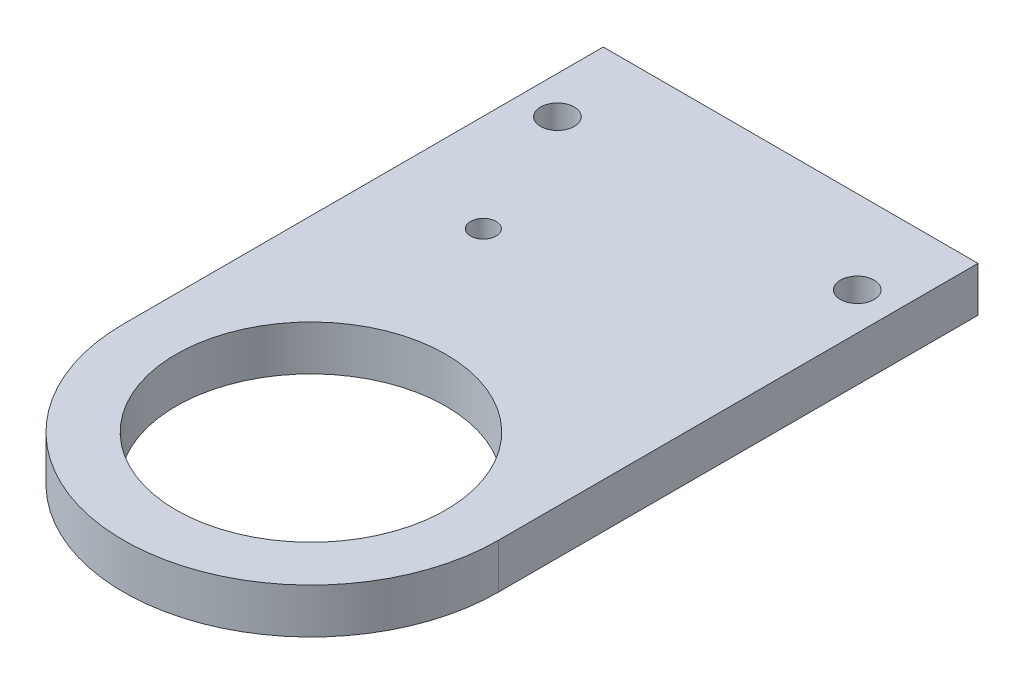
ISO-10303-21;
HEADER;
FILE_DESCRIPTION(('STEP AP214'),'2;1');
FILE_NAME('part.step','',(''),(''),'','','');
FILE_SCHEMA(('AUTOMOTIVE_DESIGN { 1 0 10303 214 1 1 1 1 }'));
ENDSEC;
DATA;
#1=APPLICATION_CONTEXT('core data for automotive mechanical design processes');
#2=APPLICATION_PROTOCOL_DEFINITION('international standard','automotive_design',2000,#1);
#3=PRODUCT_CONTEXT('',#1,'mechanical');
#4=PRODUCT('Part','Part','',(#3));
#5=PRODUCT_RELATED_PRODUCT_CATEGORY('part','',(#4));
#6=PRODUCT_DEFINITION_FORMATION('','',#4);
#7=PRODUCT_DEFINITION_CONTEXT('part definition',#1,'design');
#8=PRODUCT_DEFINITION('design','',#6,#7);
#9=PRODUCT_DEFINITION_SHAPE('','',#8);
#10=(LENGTH_UNIT() NAMED_UNIT(*) SI_UNIT(.MILLI.,.METRE.));
#11=(NAMED_UNIT(*) PLANE_ANGLE_UNIT() SI_UNIT($,.RADIAN.));
#12=(NAMED_UNIT(*) SI_UNIT($,.STERADIAN.) SOLID_ANGLE_UNIT());
#13=UNCERTAINTY_MEASURE_WITH_UNIT(LENGTH_MEASURE(1.E-05),#10,'distance_accuracy_value','');
#14=(GEOMETRIC_REPRESENTATION_CONTEXT(3) GLOBAL_UNCERTAINTY_ASSIGNED_CONTEXT((#13)) GLOBAL_UNIT_ASSIGNED_CONTEXT((#10,
#11,#12)) REPRESENTATION_CONTEXT('',''));
#15=CARTESIAN_POINT('',(0.,0.,0.));
#16=DIRECTION('',(0.,0.,1.));
#17=DIRECTION('',(1.,0.,0.));
#18=AXIS2_PLACEMENT_3D('',#15,#16,#17);
#19=CARTESIAN_POINT('',(25.,27.5,490.));
#20=DIRECTION('',(-1.,0.,0.));
#21=DIRECTION('',(0.,0.,1.));
#22=AXIS2_PLACEMENT_3D('',#19,#20,#21);
#23=PLANE('',#22);
#24=DIRECTION('',(0.,0.,-1.));
#25=VECTOR('',#24,1.);
#26=CARTESIAN_POINT('',(25.,21.5,490.));
#27=LINE('',#26,#25);
#28=CARTESIAN_POINT('',(25.,21.5,490.));
#29=VERTEX_POINT('',#28);
#30=CARTESIAN_POINT('',(25.,21.5,426.));
#31=VERTEX_POINT('',#30);
#32=EDGE_CURVE('E107',#29,#31,#27,.T.);
#33=ORIENTED_EDGE('',*,*,#32,.T.);
#34=DIRECTION('',(0.,-1.,0.));
#35=VECTOR('',#34,1.);
#36=CARTESIAN_POINT('',(25.,27.5,426.));
#37=LINE('',#36,#35);
#38=CARTESIAN_POINT('',(25.,27.5,426.));
#39=VERTEX_POINT('',#38);
#40=EDGE_CURVE('E11',#39,#31,#37,.T.);
#41=ORIENTED_EDGE('',*,*,#40,.F.);
#42=DIRECTION('',(0.,0.,-1.));
#43=VECTOR('',#42,1.);
#44=CARTESIAN_POINT('',(25.,27.5,490.));
#45=LINE('',#44,#43);
#46=CARTESIAN_POINT('',(25.,27.5,490.));
#47=VERTEX_POINT('',#46);
#48=EDGE_CURVE('E58',#47,#39,#45,.T.);
#49=ORIENTED_EDGE('',*,*,#48,.F.);
#50=DIRECTION('',(0.,-1.,0.));
#51=VECTOR('',#50,1.);
#52=CARTESIAN_POINT('',(25.,27.5,490.));
#53=LINE('',#52,#51);
#54=EDGE_CURVE('E76',#47,#29,#53,.T.);
#55=ORIENTED_EDGE('',*,*,#54,.T.);
#56=EDGE_LOOP('',(#33,#41,#49,#55));
#57=FACE_BOUND('',#56,.T.);
#58=ADVANCED_FACE('F43',(#57),#23,.F.);
#59=CARTESIAN_POINT('',(-25.,27.5,426.));
#60=DIRECTION('',(0.,0.,1.));
#61=DIRECTION('',(1.,0.,0.));
#62=AXIS2_PLACEMENT_3D('',#59,#60,#61);
#63=PLANE('',#62);
#64=DIRECTION('',(-1.,0.,0.));
#65=VECTOR('',#64,1.);
#66=CARTESIAN_POINT('',(-25.,21.5,426.));
#67=LINE('',#66,#65);
#68=CARTESIAN_POINT('',(-25.,21.5,426.));
#69=VERTEX_POINT('',#68);
#70=EDGE_CURVE('E74',#31,#69,#67,.T.);
#71=ORIENTED_EDGE('',*,*,#70,.T.);
#72=DIRECTION('',(0.,-1.,0.));
#73=VECTOR('',#72,1.);
#74=CARTESIAN_POINT('',(-25.,27.5,426.));
#75=LINE('',#74,#73);
#76=CARTESIAN_POINT('',(-25.,27.5,426.));
#77=VERTEX_POINT('',#76);
#78=EDGE_CURVE('E55',#77,#69,#75,.T.);
#79=ORIENTED_EDGE('',*,*,#78,.F.);
#80=DIRECTION('',(-1.,0.,0.));
#81=VECTOR('',#80,1.);
#82=CARTESIAN_POINT('',(-25.,27.5,426.));
#83=LINE('',#82,#81);
#84=EDGE_CURVE('E81',#39,#77,#83,.T.);
#85=ORIENTED_EDGE('',*,*,#84,.F.);
#86=ORIENTED_EDGE('',*,*,#40,.T.);
#87=EDGE_LOOP('',(#71,#79,#85,#86));
#88=FACE_BOUND('',#87,.T.);
#89=ADVANCED_FACE('F174',(#88),#63,.F.);
#90=CARTESIAN_POINT('',(-25.,27.5,490.));
#91=DIRECTION('',(1.,0.,0.));
#92=DIRECTION('',(0.,0.,-1.));
#93=AXIS2_PLACEMENT_3D('',#90,#91,#92);
#94=PLANE('',#93);
#95=DIRECTION('',(0.,0.,1.));
#96=VECTOR('',#95,1.);
#97=CARTESIAN_POINT('',(-25.,21.5,490.));
#98=LINE('',#97,#96);
#99=CARTESIAN_POINT('',(-25.,21.5,490.));
#100=VERTEX_POINT('',#99);
#101=EDGE_CURVE('E90',#69,#100,#98,.T.);
#102=ORIENTED_EDGE('',*,*,#101,.T.);
#103=DIRECTION('',(0.,-1.,0.));
#104=VECTOR('',#103,1.);
#105=CARTESIAN_POINT('',(-25.,27.5,490.));
#106=LINE('',#105,#104);
#107=CARTESIAN_POINT('',(-25.,27.5,490.));
#108=VERTEX_POINT('',#107);
#109=EDGE_CURVE('E91',#108,#100,#106,.T.);
#110=ORIENTED_EDGE('',*,*,#109,.F.);
#111=DIRECTION('',(0.,0.,1.));
#112=VECTOR('',#111,1.);
#113=CARTESIAN_POINT('',(-25.,27.5,490.));
#114=LINE('',#113,#112);
#115=EDGE_CURVE('E127',#77,#108,#114,.T.);
#116=ORIENTED_EDGE('',*,*,#115,.F.);
#117=ORIENTED_EDGE('',*,*,#78,.T.);
#118=EDGE_LOOP('',(#102,#110,#116,#117));
#119=FACE_BOUND('',#118,.T.);
#120=ADVANCED_FACE('F93',(#119),#94,.F.);
#121=CARTESIAN_POINT('',(0.,27.5,0.));
#122=DIRECTION('',(0.,-1.,0.));
#123=DIRECTION('',(0.,0.,-1.));
#124=AXIS2_PLACEMENT_3D('',#121,#122,#123);
#125=PLANE('',#124);
#126=CARTESIAN_POINT('',(-12.,27.5,455.));
#127=DIRECTION('',(0.,1.,0.));
#128=DIRECTION('',(0.,0.,1.));
#129=AXIS2_PLACEMENT_3D('',#126,#127,#128);
#130=CIRCLE('',#129,1.7);
#131=CARTESIAN_POINT('',(-12.,27.5,456.7));
#132=VERTEX_POINT('',#131);
#133=EDGE_CURVE('E146',#132,#132,#130,.T.);
#134=ORIENTED_EDGE('',*,*,#133,.F.);
#135=EDGE_LOOP('',(#134));
#136=FACE_BOUND('',#135,.T.);
#137=CARTESIAN_POINT('',(-20.,27.5,437.11));
#138=DIRECTION('',(0.,1.,0.));
#139=DIRECTION('',(0.,0.,1.));
#140=AXIS2_PLACEMENT_3D('',#137,#138,#139);
#141=CIRCLE('',#140,2.25);
#142=CARTESIAN_POINT('',(-20.,27.5,439.36));
#143=VERTEX_POINT('',#142);
#144=EDGE_CURVE('E134',#143,#143,#141,.T.);
#145=ORIENTED_EDGE('',*,*,#144,.F.);
#146=EDGE_LOOP('',(#145));
#147=FACE_BOUND('',#146,.T.);
#148=CARTESIAN_POINT('',(20.,27.5,437.11));
#149=DIRECTION('',(0.,1.,0.));
#150=DIRECTION('',(0.,0.,1.));
#151=AXIS2_PLACEMENT_3D('',#148,#149,#150);
#152=CIRCLE('',#151,2.25);
#153=CARTESIAN_POINT('',(20.,27.5,439.36));
#154=VERTEX_POINT('',#153);
#155=EDGE_CURVE('E142',#154,#154,#152,.T.);
#156=ORIENTED_EDGE('',*,*,#155,.F.);
#157=EDGE_LOOP('',(#156));
#158=FACE_BOUND('',#157,.T.);
#159=CARTESIAN_POINT('',(0.,27.5,490.));
#160=DIRECTION('',(0.,1.,0.));
#161=DIRECTION('',(0.,0.,1.));
#162=AXIS2_PLACEMENT_3D('',#159,#160,#161);
#163=CIRCLE('',#162,18.);
#164=CARTESIAN_POINT('',(0.,27.5,508.));
#165=VERTEX_POINT('',#164);
#166=EDGE_CURVE('E109',#165,#165,#163,.T.);
#167=ORIENTED_EDGE('',*,*,#166,.F.);
#168=EDGE_LOOP('',(#167));
#169=FACE_BOUND('',#168,.T.);
#170=ORIENTED_EDGE('',*,*,#115,.T.);
#171=CARTESIAN_POINT('',(0.,27.5,490.));
#172=DIRECTION('',(0.,1.,0.));
#173=DIRECTION('',(0.,0.,1.));
#174=AXIS2_PLACEMENT_3D('',#171,#172,#173);
#175=CIRCLE('',#174,25.);
#176=EDGE_CURVE('E102',#108,#47,#175,.T.);
#177=ORIENTED_EDGE('',*,*,#176,.T.);
#178=ORIENTED_EDGE('',*,*,#48,.T.);
#179=ORIENTED_EDGE('',*,*,#84,.T.);
#180=EDGE_LOOP('',(#170,#177,#178,#179));
#181=FACE_BOUND('',#180,.T.);
#182=ADVANCED_FACE('F163',(#136,#147,#158,#169,#181),#125,.F.);
#183=CARTESIAN_POINT('',(0.,21.5,0.));
#184=DIRECTION('',(0.,-1.,0.));
#185=DIRECTION('',(0.,0.,-1.));
#186=AXIS2_PLACEMENT_3D('',#183,#184,#185);
#187=PLANE('',#186);
#188=CARTESIAN_POINT('',(-12.,21.5,455.));
#189=DIRECTION('',(0.,1.,0.));
#190=DIRECTION('',(0.,0.,1.));
#191=AXIS2_PLACEMENT_3D('',#188,#189,#190);
#192=CIRCLE('',#191,1.7);
#193=CARTESIAN_POINT('',(-12.,21.5,456.7));
#194=VERTEX_POINT('',#193);
#195=EDGE_CURVE('E148',#194,#194,#192,.T.);
#196=ORIENTED_EDGE('',*,*,#195,.T.);
#197=EDGE_LOOP('',(#196));
#198=FACE_BOUND('',#197,.T.);
#199=CARTESIAN_POINT('',(-20.,21.5,437.11));
#200=DIRECTION('',(0.,1.,0.));
#201=DIRECTION('',(0.,0.,1.));
#202=AXIS2_PLACEMENT_3D('',#199,#200,#201);
#203=CIRCLE('',#202,2.25);
#204=CARTESIAN_POINT('',(-20.,21.5,439.36));
#205=VERTEX_POINT('',#204);
#206=EDGE_CURVE('E138',#205,#205,#203,.T.);
#207=ORIENTED_EDGE('',*,*,#206,.T.);
#208=EDGE_LOOP('',(#207));
#209=FACE_BOUND('',#208,.T.);
#210=CARTESIAN_POINT('',(20.,21.5,437.11));
#211=DIRECTION('',(0.,1.,0.));
#212=DIRECTION('',(0.,0.,1.));
#213=AXIS2_PLACEMENT_3D('',#210,#211,#212);
#214=CIRCLE('',#213,2.25);
#215=CARTESIAN_POINT('',(20.,21.5,439.36));
#216=VERTEX_POINT('',#215);
#217=EDGE_CURVE('E137',#216,#216,#214,.T.);
#218=ORIENTED_EDGE('',*,*,#217,.T.);
#219=EDGE_LOOP('',(#218));
#220=FACE_BOUND('',#219,.T.);
#221=CARTESIAN_POINT('',(0.,21.5,490.));
#222=DIRECTION('',(0.,1.,0.));
#223=DIRECTION('',(0.,0.,1.));
#224=AXIS2_PLACEMENT_3D('',#221,#222,#223);
#225=CIRCLE('',#224,18.);
#226=CARTESIAN_POINT('',(0.,21.5,508.));
#227=VERTEX_POINT('',#226);
#228=EDGE_CURVE('E116',#227,#227,#225,.T.);
#229=ORIENTED_EDGE('',*,*,#228,.T.);
#230=EDGE_LOOP('',(#229));
#231=FACE_BOUND('',#230,.T.);
#232=ORIENTED_EDGE('',*,*,#32,.F.);
#233=CARTESIAN_POINT('',(0.,21.5,490.));
#234=DIRECTION('',(0.,1.,0.));
#235=DIRECTION('',(0.,0.,1.));
#236=AXIS2_PLACEMENT_3D('',#233,#234,#235);
#237=CIRCLE('',#236,25.);
#238=EDGE_CURVE('E105',#100,#29,#237,.T.);
#239=ORIENTED_EDGE('',*,*,#238,.F.);
#240=ORIENTED_EDGE('',*,*,#101,.F.);
#241=ORIENTED_EDGE('',*,*,#70,.F.);
#242=EDGE_LOOP('',(#232,#239,#240,#241));
#243=FACE_BOUND('',#242,.T.);
#244=ADVANCED_FACE('F110',(#198,#209,#220,#231,#243),#187,.T.);
#245=CARTESIAN_POINT('',(0.,27.5,490.));
#246=DIRECTION('',(0.,-1.,0.));
#247=DIRECTION('',(0.,0.,-1.));
#248=AXIS2_PLACEMENT_3D('',#245,#246,#247);
#249=CYLINDRICAL_SURFACE('',#248,25.);
#250=ORIENTED_EDGE('',*,*,#238,.T.);
#251=ORIENTED_EDGE('',*,*,#54,.F.);
#252=ORIENTED_EDGE('',*,*,#176,.F.);
#253=ORIENTED_EDGE('',*,*,#109,.T.);
#254=EDGE_LOOP('',(#250,#251,#252,#253));
#255=FACE_BOUND('',#254,.T.);
#256=ADVANCED_FACE('F101',(#255),#249,.T.);
#257=CARTESIAN_POINT('',(0.,27.5,490.));
#258=DIRECTION('',(0.,-1.,0.));
#259=DIRECTION('',(0.,0.,-1.));
#260=AXIS2_PLACEMENT_3D('',#257,#258,#259);
#261=CYLINDRICAL_SURFACE('',#260,18.);
#262=ORIENTED_EDGE('',*,*,#166,.T.);
#263=EDGE_LOOP('',(#262));
#264=FACE_BOUND('',#263,.T.);
#265=ORIENTED_EDGE('',*,*,#228,.F.);
#266=EDGE_LOOP('',(#265));
#267=FACE_BOUND('',#266,.T.);
#268=ADVANCED_FACE('F188',(#264,#267),#261,.F.);
#269=CARTESIAN_POINT('',(20.,27.5,437.11));
#270=DIRECTION('',(0.,-1.,0.));
#271=DIRECTION('',(0.,0.,-1.));
#272=AXIS2_PLACEMENT_3D('',#269,#270,#271);
#273=CYLINDRICAL_SURFACE('',#272,2.25);
#274=ORIENTED_EDGE('',*,*,#155,.T.);
#275=EDGE_LOOP('',(#274));
#276=FACE_BOUND('',#275,.T.);
#277=ORIENTED_EDGE('',*,*,#217,.F.);
#278=EDGE_LOOP('',(#277));
#279=FACE_BOUND('',#278,.T.);
#280=ADVANCED_FACE('F189',(#276,#279),#273,.F.);
#281=CARTESIAN_POINT('',(-20.,27.5,437.11));
#282=DIRECTION('',(0.,-1.,0.));
#283=DIRECTION('',(0.,0.,-1.));
#284=AXIS2_PLACEMENT_3D('',#281,#282,#283);
#285=CYLINDRICAL_SURFACE('',#284,2.25);
#286=ORIENTED_EDGE('',*,*,#144,.T.);
#287=EDGE_LOOP('',(#286));
#288=FACE_BOUND('',#287,.T.);
#289=ORIENTED_EDGE('',*,*,#206,.F.);
#290=EDGE_LOOP('',(#289));
#291=FACE_BOUND('',#290,.T.);
#292=ADVANCED_FACE('F191',(#288,#291),#285,.F.);
#293=CARTESIAN_POINT('',(-12.,27.5,455.));
#294=DIRECTION('',(0.,-1.,0.));
#295=DIRECTION('',(0.,0.,-1.));
#296=AXIS2_PLACEMENT_3D('',#293,#294,#295);
#297=CYLINDRICAL_SURFACE('',#296,1.7);
#298=ORIENTED_EDGE('',*,*,#133,.T.);
#299=EDGE_LOOP('',(#298));
#300=FACE_BOUND('',#299,.T.);
#301=ORIENTED_EDGE('',*,*,#195,.F.);
#302=EDGE_LOOP('',(#301));
#303=FACE_BOUND('',#302,.T.);
#304=ADVANCED_FACE('F161',(#300,#303),#297,.F.);
#305=CLOSED_SHELL('',(#58,#89,#120,#182,#244,#256,#268,#280,#292,#304));
#306=MANIFOLD_SOLID_BREP('B2',#305);
#307=ADVANCED_BREP_SHAPE_REPRESENTATION('',(#18,#306),#14);
#308=SHAPE_DEFINITION_REPRESENTATION(#9,#307);
ENDSEC;
END-ISO-10303-21;
